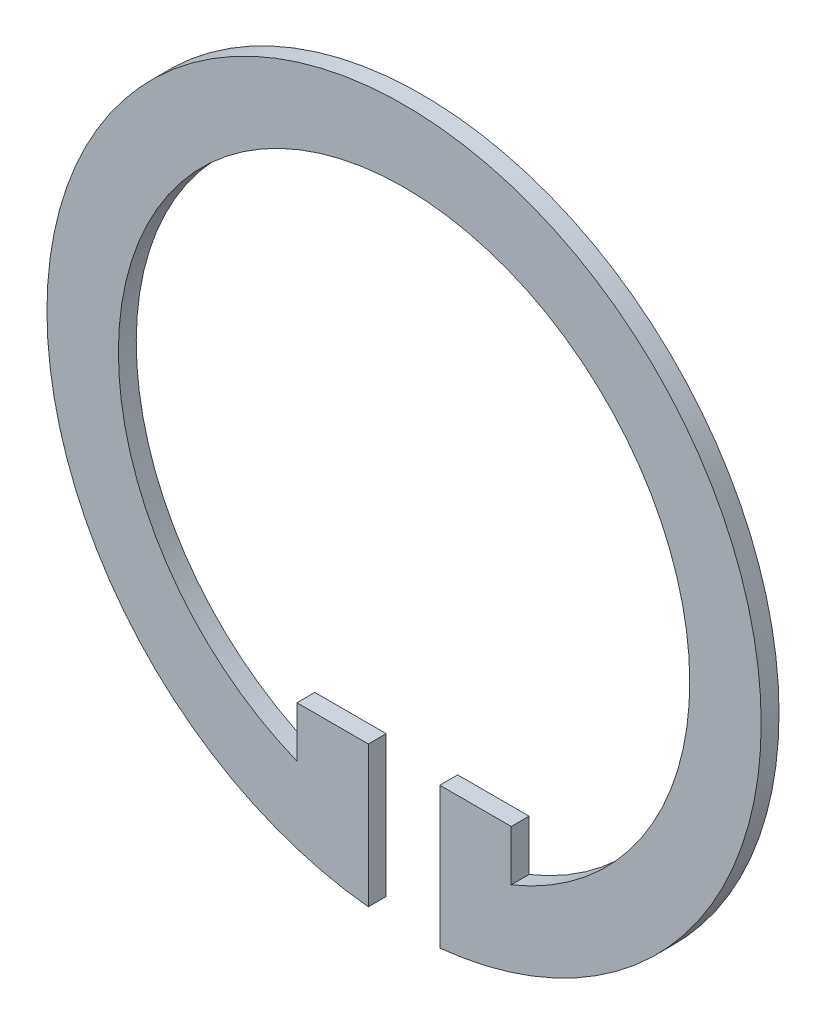
ISO-10303-21;
HEADER;
FILE_DESCRIPTION(('STEP AP214'),'2;1');
FILE_NAME('part.step','',(''),(''),'','','');
FILE_SCHEMA(('AUTOMOTIVE_DESIGN { 1 0 10303 214 1 1 1 1 }'));
ENDSEC;
DATA;
#1=APPLICATION_CONTEXT('core data for automotive mechanical design processes');
#2=APPLICATION_PROTOCOL_DEFINITION('international standard','automotive_design',2000,#1);
#3=PRODUCT_CONTEXT('',#1,'mechanical');
#4=PRODUCT('Part','Part','',(#3));
#5=PRODUCT_RELATED_PRODUCT_CATEGORY('part','',(#4));
#6=PRODUCT_DEFINITION_FORMATION('','',#4);
#7=PRODUCT_DEFINITION_CONTEXT('part definition',#1,'design');
#8=PRODUCT_DEFINITION('design','',#6,#7);
#9=PRODUCT_DEFINITION_SHAPE('','',#8);
#10=(LENGTH_UNIT() NAMED_UNIT(*) SI_UNIT(.MILLI.,.METRE.));
#11=(NAMED_UNIT(*) PLANE_ANGLE_UNIT() SI_UNIT($,.RADIAN.));
#12=(NAMED_UNIT(*) SI_UNIT($,.STERADIAN.) SOLID_ANGLE_UNIT());
#13=UNCERTAINTY_MEASURE_WITH_UNIT(LENGTH_MEASURE(1.E-05),#10,'distance_accuracy_value','');
#14=(GEOMETRIC_REPRESENTATION_CONTEXT(3) GLOBAL_UNCERTAINTY_ASSIGNED_CONTEXT((#13)) GLOBAL_UNIT_ASSIGNED_CONTEXT((#10,
#11,#12)) REPRESENTATION_CONTEXT('',''));
#15=CARTESIAN_POINT('',(0.,0.,0.));
#16=DIRECTION('',(0.,0.,1.));
#17=DIRECTION('',(1.,0.,0.));
#18=AXIS2_PLACEMENT_3D('',#15,#16,#17);
#19=CARTESIAN_POINT('',(0.,0.,0.5));
#20=DIRECTION('',(0.,0.,-1.));
#21=DIRECTION('',(-1.,0.,0.));
#22=AXIS2_PLACEMENT_3D('',#19,#20,#21);
#23=CYLINDRICAL_SURFACE('',#22,10.);
#24=CARTESIAN_POINT('',(0.,0.,0.));
#25=DIRECTION('',(0.,0.,1.));
#26=DIRECTION('',(1.,0.,0.));
#27=AXIS2_PLACEMENT_3D('',#24,#25,#26);
#28=CIRCLE('',#27,10.);
#29=CARTESIAN_POINT('',(1.,-9.9498743710662,0.));
#30=VERTEX_POINT('',#29);
#31=CARTESIAN_POINT('',(-0.999999999999997,-9.9498743710662,0.));
#32=VERTEX_POINT('',#31);
#33=EDGE_CURVE('E110',#30,#32,#28,.T.);
#34=ORIENTED_EDGE('',*,*,#33,.T.);
#35=DIRECTION('',(0.,0.,-1.));
#36=VECTOR('',#35,1.);
#37=CARTESIAN_POINT('',(-0.999999999999997,-9.9498743710662,0.5));
#38=LINE('',#37,#36);
#39=CARTESIAN_POINT('',(-0.999999999999997,-9.9498743710662,0.5));
#40=VERTEX_POINT('',#39);
#41=EDGE_CURVE('E11',#40,#32,#38,.T.);
#42=ORIENTED_EDGE('',*,*,#41,.F.);
#43=CARTESIAN_POINT('',(0.,0.,0.5));
#44=DIRECTION('',(0.,0.,1.));
#45=DIRECTION('',(1.,0.,0.));
#46=AXIS2_PLACEMENT_3D('',#43,#44,#45);
#47=CIRCLE('',#46,10.);
#48=CARTESIAN_POINT('',(1.,-9.9498743710662,0.5));
#49=VERTEX_POINT('',#48);
#50=EDGE_CURVE('E146',#49,#40,#47,.T.);
#51=ORIENTED_EDGE('',*,*,#50,.F.);
#52=DIRECTION('',(0.,0.,-1.));
#53=VECTOR('',#52,1.);
#54=CARTESIAN_POINT('',(1.,-9.9498743710662,0.5));
#55=LINE('',#54,#53);
#56=EDGE_CURVE('E124',#49,#30,#55,.T.);
#57=ORIENTED_EDGE('',*,*,#56,.T.);
#58=EDGE_LOOP('',(#34,#42,#51,#57));
#59=FACE_BOUND('',#58,.T.);
#60=ADVANCED_FACE('F41',(#59),#23,.T.);
#61=CARTESIAN_POINT('',(-0.999999999999997,-6.,0.5));
#62=DIRECTION('',(-1.,0.,0.));
#63=DIRECTION('',(0.,-1.,0.));
#64=AXIS2_PLACEMENT_3D('',#61,#62,#63);
#65=PLANE('',#64);
#66=DIRECTION('',(0.,1.,0.));
#67=VECTOR('',#66,1.);
#68=CARTESIAN_POINT('',(-0.999999999999997,-6.,0.));
#69=LINE('',#68,#67);
#70=CARTESIAN_POINT('',(-0.999999999999997,-6.,0.));
#71=VERTEX_POINT('',#70);
#72=EDGE_CURVE('E106',#32,#71,#69,.T.);
#73=ORIENTED_EDGE('',*,*,#72,.T.);
#74=DIRECTION('',(0.,0.,-1.));
#75=VECTOR('',#74,1.);
#76=CARTESIAN_POINT('',(-0.999999999999997,-6.,0.5));
#77=LINE('',#76,#75);
#78=CARTESIAN_POINT('',(-0.999999999999997,-6.,0.5));
#79=VERTEX_POINT('',#78);
#80=EDGE_CURVE('E49',#79,#71,#77,.T.);
#81=ORIENTED_EDGE('',*,*,#80,.F.);
#82=DIRECTION('',(0.,1.,0.));
#83=VECTOR('',#82,1.);
#84=CARTESIAN_POINT('',(-0.999999999999997,-6.,0.5));
#85=LINE('',#84,#83);
#86=EDGE_CURVE('E120',#40,#79,#85,.T.);
#87=ORIENTED_EDGE('',*,*,#86,.F.);
#88=ORIENTED_EDGE('',*,*,#41,.T.);
#89=EDGE_LOOP('',(#73,#81,#87,#88));
#90=FACE_BOUND('',#89,.T.);
#91=ADVANCED_FACE('F119',(#90),#65,.F.);
#92=CARTESIAN_POINT('',(-3.,-6.,0.5));
#93=DIRECTION('',(0.,-1.,0.));
#94=DIRECTION('',(0.,0.,-1.));
#95=AXIS2_PLACEMENT_3D('',#92,#93,#94);
#96=PLANE('',#95);
#97=DIRECTION('',(-1.,0.,0.));
#98=VECTOR('',#97,1.);
#99=CARTESIAN_POINT('',(-3.,-6.,0.));
#100=LINE('',#99,#98);
#101=CARTESIAN_POINT('',(-3.,-6.,0.));
#102=VERTEX_POINT('',#101);
#103=EDGE_CURVE('E112',#71,#102,#100,.T.);
#104=ORIENTED_EDGE('',*,*,#103,.T.);
#105=DIRECTION('',(0.,0.,-1.));
#106=VECTOR('',#105,1.);
#107=CARTESIAN_POINT('',(-3.,-6.,0.5));
#108=LINE('',#107,#106);
#109=CARTESIAN_POINT('',(-3.,-6.,0.5));
#110=VERTEX_POINT('',#109);
#111=EDGE_CURVE('E185',#110,#102,#108,.T.);
#112=ORIENTED_EDGE('',*,*,#111,.F.);
#113=DIRECTION('',(-1.,0.,0.));
#114=VECTOR('',#113,1.);
#115=CARTESIAN_POINT('',(-3.,-6.,0.5));
#116=LINE('',#115,#114);
#117=EDGE_CURVE('E151',#79,#110,#116,.T.);
#118=ORIENTED_EDGE('',*,*,#117,.F.);
#119=ORIENTED_EDGE('',*,*,#80,.T.);
#120=EDGE_LOOP('',(#104,#112,#118,#119));
#121=FACE_BOUND('',#120,.T.);
#122=ADVANCED_FACE('F192',(#121),#96,.F.);
#123=CARTESIAN_POINT('',(-3.,-6.,0.5));
#124=DIRECTION('',(1.,0.,0.));
#125=DIRECTION('',(0.,0.,-1.));
#126=AXIS2_PLACEMENT_3D('',#123,#124,#125);
#127=PLANE('',#126);
#128=DIRECTION('',(0.,-1.,0.));
#129=VECTOR('',#128,1.);
#130=CARTESIAN_POINT('',(-3.,-6.,0.));
#131=LINE('',#130,#129);
#132=CARTESIAN_POINT('',(-3.00000000000001,-7.41619848709566,0.));
#133=VERTEX_POINT('',#132);
#134=EDGE_CURVE('E131',#102,#133,#131,.T.);
#135=ORIENTED_EDGE('',*,*,#134,.T.);
#136=DIRECTION('',(0.,0.,-1.));
#137=VECTOR('',#136,1.);
#138=CARTESIAN_POINT('',(-3.00000000000001,-7.41619848709566,0.5));
#139=LINE('',#138,#137);
#140=CARTESIAN_POINT('',(-3.00000000000001,-7.41619848709566,0.5));
#141=VERTEX_POINT('',#140);
#142=EDGE_CURVE('E181',#141,#133,#139,.T.);
#143=ORIENTED_EDGE('',*,*,#142,.F.);
#144=DIRECTION('',(0.,-1.,0.));
#145=VECTOR('',#144,1.);
#146=CARTESIAN_POINT('',(-3.,-6.,0.5));
#147=LINE('',#146,#145);
#148=EDGE_CURVE('E154',#110,#141,#147,.T.);
#149=ORIENTED_EDGE('',*,*,#148,.F.);
#150=ORIENTED_EDGE('',*,*,#111,.T.);
#151=EDGE_LOOP('',(#135,#143,#149,#150));
#152=FACE_BOUND('',#151,.T.);
#153=ADVANCED_FACE('F200',(#152),#127,.F.);
#154=CARTESIAN_POINT('',(0.,0.,0.5));
#155=DIRECTION('',(0.,0.,-1.));
#156=DIRECTION('',(-1.,0.,0.));
#157=AXIS2_PLACEMENT_3D('',#154,#155,#156);
#158=CYLINDRICAL_SURFACE('',#157,8.);
#159=CARTESIAN_POINT('',(0.,0.,0.));
#160=DIRECTION('',(0.,0.,-1.));
#161=DIRECTION('',(1.,0.,0.));
#162=AXIS2_PLACEMENT_3D('',#159,#160,#161);
#163=CIRCLE('',#162,8.);
#164=CARTESIAN_POINT('',(3.,-7.41619848709566,0.));
#165=VERTEX_POINT('',#164);
#166=EDGE_CURVE('E134',#133,#165,#163,.T.);
#167=ORIENTED_EDGE('',*,*,#166,.T.);
#168=DIRECTION('',(0.,0.,-1.));
#169=VECTOR('',#168,1.);
#170=CARTESIAN_POINT('',(3.,-7.41619848709566,0.5));
#171=LINE('',#170,#169);
#172=CARTESIAN_POINT('',(3.,-7.41619848709566,0.5));
#173=VERTEX_POINT('',#172);
#174=EDGE_CURVE('E177',#173,#165,#171,.T.);
#175=ORIENTED_EDGE('',*,*,#174,.F.);
#176=CARTESIAN_POINT('',(0.,0.,0.5));
#177=DIRECTION('',(0.,0.,-1.));
#178=DIRECTION('',(1.,0.,0.));
#179=AXIS2_PLACEMENT_3D('',#176,#177,#178);
#180=CIRCLE('',#179,8.);
#181=EDGE_CURVE('E157',#141,#173,#180,.T.);
#182=ORIENTED_EDGE('',*,*,#181,.F.);
#183=ORIENTED_EDGE('',*,*,#142,.T.);
#184=EDGE_LOOP('',(#167,#175,#182,#183));
#185=FACE_BOUND('',#184,.T.);
#186=ADVANCED_FACE('F203',(#185),#158,.F.);
#187=CARTESIAN_POINT('',(3.,-6.,0.5));
#188=DIRECTION('',(-1.,0.,0.));
#189=DIRECTION('',(0.,-1.,0.));
#190=AXIS2_PLACEMENT_3D('',#187,#188,#189);
#191=PLANE('',#190);
#192=DIRECTION('',(0.,1.,0.));
#193=VECTOR('',#192,1.);
#194=CARTESIAN_POINT('',(3.,-6.,0.));
#195=LINE('',#194,#193);
#196=CARTESIAN_POINT('',(3.,-6.,0.));
#197=VERTEX_POINT('',#196);
#198=EDGE_CURVE('E137',#165,#197,#195,.T.);
#199=ORIENTED_EDGE('',*,*,#198,.T.);
#200=DIRECTION('',(0.,0.,-1.));
#201=VECTOR('',#200,1.);
#202=CARTESIAN_POINT('',(3.,-6.,0.5));
#203=LINE('',#202,#201);
#204=CARTESIAN_POINT('',(3.,-6.,0.5));
#205=VERTEX_POINT('',#204);
#206=EDGE_CURVE('E173',#205,#197,#203,.T.);
#207=ORIENTED_EDGE('',*,*,#206,.F.);
#208=DIRECTION('',(0.,1.,0.));
#209=VECTOR('',#208,1.);
#210=CARTESIAN_POINT('',(3.,-6.,0.5));
#211=LINE('',#210,#209);
#212=EDGE_CURVE('E160',#173,#205,#211,.T.);
#213=ORIENTED_EDGE('',*,*,#212,.F.);
#214=ORIENTED_EDGE('',*,*,#174,.T.);
#215=EDGE_LOOP('',(#199,#207,#213,#214));
#216=FACE_BOUND('',#215,.T.);
#217=ADVANCED_FACE('F208',(#216),#191,.F.);
#218=CARTESIAN_POINT('',(1.,-6.,0.5));
#219=DIRECTION('',(0.,-1.,0.));
#220=DIRECTION('',(0.,0.,-1.));
#221=AXIS2_PLACEMENT_3D('',#218,#219,#220);
#222=PLANE('',#221);
#223=DIRECTION('',(-1.,0.,0.));
#224=VECTOR('',#223,1.);
#225=CARTESIAN_POINT('',(1.,-6.,0.));
#226=LINE('',#225,#224);
#227=CARTESIAN_POINT('',(1.,-6.,0.));
#228=VERTEX_POINT('',#227);
#229=EDGE_CURVE('E140',#197,#228,#226,.T.);
#230=ORIENTED_EDGE('',*,*,#229,.T.);
#231=DIRECTION('',(0.,0.,-1.));
#232=VECTOR('',#231,1.);
#233=CARTESIAN_POINT('',(1.,-6.,0.5));
#234=LINE('',#233,#232);
#235=CARTESIAN_POINT('',(1.,-6.,0.5));
#236=VERTEX_POINT('',#235);
#237=EDGE_CURVE('E169',#236,#228,#234,.T.);
#238=ORIENTED_EDGE('',*,*,#237,.F.);
#239=DIRECTION('',(-1.,0.,0.));
#240=VECTOR('',#239,1.);
#241=CARTESIAN_POINT('',(1.,-6.,0.5));
#242=LINE('',#241,#240);
#243=EDGE_CURVE('E61',#205,#236,#242,.T.);
#244=ORIENTED_EDGE('',*,*,#243,.F.);
#245=ORIENTED_EDGE('',*,*,#206,.T.);
#246=EDGE_LOOP('',(#230,#238,#244,#245));
#247=FACE_BOUND('',#246,.T.);
#248=ADVANCED_FACE('F211',(#247),#222,.F.);
#249=CARTESIAN_POINT('',(1.,-6.,0.5));
#250=DIRECTION('',(1.,0.,0.));
#251=DIRECTION('',(0.,1.,0.));
#252=AXIS2_PLACEMENT_3D('',#249,#250,#251);
#253=PLANE('',#252);
#254=DIRECTION('',(0.,-1.,0.));
#255=VECTOR('',#254,1.);
#256=CARTESIAN_POINT('',(1.,-6.,0.));
#257=LINE('',#256,#255);
#258=EDGE_CURVE('E143',#228,#30,#257,.T.);
#259=ORIENTED_EDGE('',*,*,#258,.T.);
#260=ORIENTED_EDGE('',*,*,#56,.F.);
#261=DIRECTION('',(0.,-1.,0.));
#262=VECTOR('',#261,1.);
#263=CARTESIAN_POINT('',(1.,-6.,0.5));
#264=LINE('',#263,#262);
#265=EDGE_CURVE('E56',#236,#49,#264,.T.);
#266=ORIENTED_EDGE('',*,*,#265,.F.);
#267=ORIENTED_EDGE('',*,*,#237,.T.);
#268=EDGE_LOOP('',(#259,#260,#266,#267));
#269=FACE_BOUND('',#268,.T.);
#270=ADVANCED_FACE('F213',(#269),#253,.F.);
#271=CARTESIAN_POINT('',(0.,0.,0.5));
#272=DIRECTION('',(0.,0.,1.));
#273=DIRECTION('',(1.,0.,0.));
#274=AXIS2_PLACEMENT_3D('',#271,#272,#273);
#275=PLANE('',#274);
#276=ORIENTED_EDGE('',*,*,#50,.T.);
#277=ORIENTED_EDGE('',*,*,#86,.T.);
#278=ORIENTED_EDGE('',*,*,#117,.T.);
#279=ORIENTED_EDGE('',*,*,#148,.T.);
#280=ORIENTED_EDGE('',*,*,#181,.T.);
#281=ORIENTED_EDGE('',*,*,#212,.T.);
#282=ORIENTED_EDGE('',*,*,#243,.T.);
#283=ORIENTED_EDGE('',*,*,#265,.T.);
#284=EDGE_LOOP('',(#276,#277,#278,#279,#280,#281,#282,#283));
#285=FACE_BOUND('',#284,.T.);
#286=ADVANCED_FACE('F195',(#285),#275,.T.);
#287=CARTESIAN_POINT('',(0.,0.,0.));
#288=DIRECTION('',(0.,0.,1.));
#289=DIRECTION('',(1.,0.,0.));
#290=AXIS2_PLACEMENT_3D('',#287,#288,#289);
#291=PLANE('',#290);
#292=ORIENTED_EDGE('',*,*,#33,.F.);
#293=ORIENTED_EDGE('',*,*,#258,.F.);
#294=ORIENTED_EDGE('',*,*,#229,.F.);
#295=ORIENTED_EDGE('',*,*,#198,.F.);
#296=ORIENTED_EDGE('',*,*,#166,.F.);
#297=ORIENTED_EDGE('',*,*,#134,.F.);
#298=ORIENTED_EDGE('',*,*,#103,.F.);
#299=ORIENTED_EDGE('',*,*,#72,.F.);
#300=EDGE_LOOP('',(#292,#293,#294,#295,#296,#297,#298,#299));
#301=FACE_BOUND('',#300,.T.);
#302=ADVANCED_FACE('F107',(#301),#291,.F.);
#303=CLOSED_SHELL('',(#60,#91,#122,#153,#186,#217,#248,#270,#286,#302));
#304=MANIFOLD_SOLID_BREP('B2',#303);
#305=ADVANCED_BREP_SHAPE_REPRESENTATION('',(#18,#304),#14);
#306=SHAPE_DEFINITION_REPRESENTATION(#9,#305);
ENDSEC;
END-ISO-10303-21;
